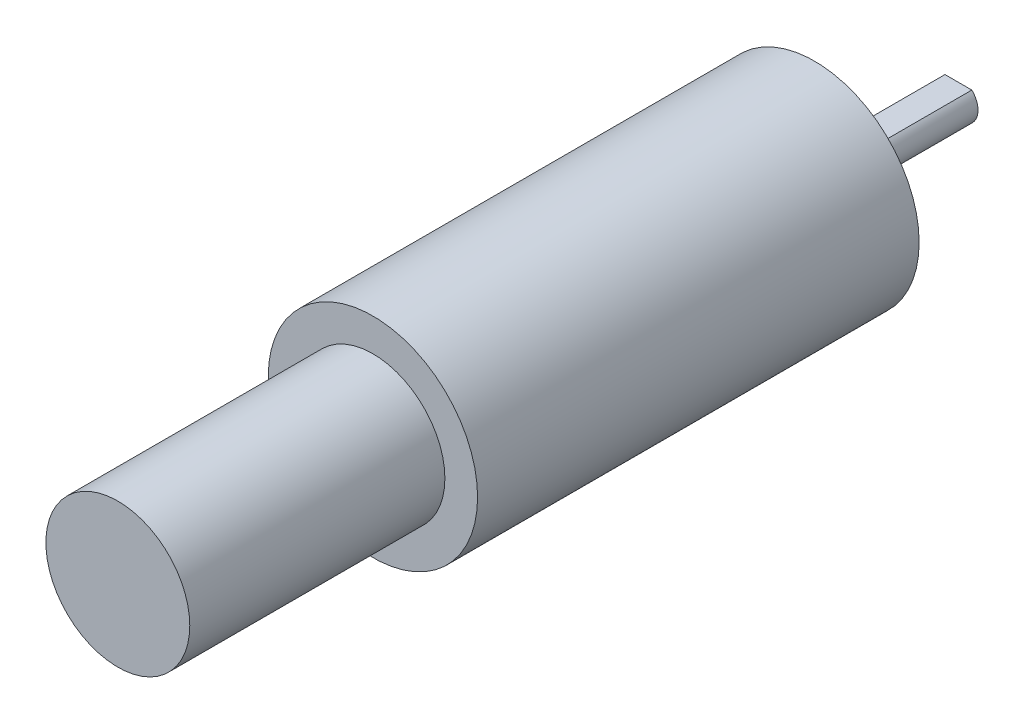
ISO-10303-21;
HEADER;
FILE_DESCRIPTION(('STEP AP214'),'2;1');
FILE_NAME('part.step','',(''),(''),'','','');
FILE_SCHEMA(('AUTOMOTIVE_DESIGN { 1 0 10303 214 1 1 1 1 }'));
ENDSEC;
DATA;
#1=APPLICATION_CONTEXT('core data for automotive mechanical design processes');
#2=APPLICATION_PROTOCOL_DEFINITION('international standard','automotive_design',2000,#1);
#3=PRODUCT_CONTEXT('',#1,'mechanical');
#4=PRODUCT('Part','Part','',(#3));
#5=PRODUCT_RELATED_PRODUCT_CATEGORY('part','',(#4));
#6=PRODUCT_DEFINITION_FORMATION('','',#4);
#7=PRODUCT_DEFINITION_CONTEXT('part definition',#1,'design');
#8=PRODUCT_DEFINITION('design','',#6,#7);
#9=PRODUCT_DEFINITION_SHAPE('','',#8);
#10=(LENGTH_UNIT() NAMED_UNIT(*) SI_UNIT(.MILLI.,.METRE.));
#11=(NAMED_UNIT(*) PLANE_ANGLE_UNIT() SI_UNIT($,.RADIAN.));
#12=(NAMED_UNIT(*) SI_UNIT($,.STERADIAN.) SOLID_ANGLE_UNIT());
#13=UNCERTAINTY_MEASURE_WITH_UNIT(LENGTH_MEASURE(1.E-05),#10,'distance_accuracy_value','');
#14=(GEOMETRIC_REPRESENTATION_CONTEXT(3) GLOBAL_UNCERTAINTY_ASSIGNED_CONTEXT((#13)) GLOBAL_UNIT_ASSIGNED_CONTEXT((#10,
#11,#12)) REPRESENTATION_CONTEXT('',''));
#15=CARTESIAN_POINT('',(0.,0.,0.));
#16=DIRECTION('',(0.,0.,1.));
#17=DIRECTION('',(1.,0.,0.));
#18=AXIS2_PLACEMENT_3D('',#15,#16,#17);
#19=CARTESIAN_POINT('',(0.,0.,67.5));
#20=DIRECTION('',(0.,0.,1.));
#21=DIRECTION('',(1.,0.,0.));
#22=AXIS2_PLACEMENT_3D('',#19,#20,#21);
#23=PLANE('',#22);
#24=CARTESIAN_POINT('',(0.,0.,67.5));
#25=DIRECTION('',(0.,0.,1.));
#26=DIRECTION('',(1.,0.,0.));
#27=AXIS2_PLACEMENT_3D('',#24,#25,#26);
#28=CIRCLE('',#27,16.);
#29=CARTESIAN_POINT('',(16.,0.,67.5));
#30=VERTEX_POINT('',#29);
#31=EDGE_CURVE('E128',#30,#30,#28,.T.);
#32=ORIENTED_EDGE('',*,*,#31,.T.);
#33=EDGE_LOOP('',(#32));
#34=FACE_BOUND('',#33,.T.);
#35=CARTESIAN_POINT('',(0.,0.,67.5));
#36=DIRECTION('',(0.,0.,1.));
#37=DIRECTION('',(1.,0.,0.));
#38=AXIS2_PLACEMENT_3D('',#35,#36,#37);
#39=CIRCLE('',#38,11.);
#40=CARTESIAN_POINT('',(11.,0.,67.5));
#41=VERTEX_POINT('',#40);
#42=EDGE_CURVE('E108',#41,#41,#39,.T.);
#43=ORIENTED_EDGE('',*,*,#42,.F.);
#44=EDGE_LOOP('',(#43));
#45=FACE_BOUND('',#44,.T.);
#46=ADVANCED_FACE('F36',(#34,#45),#23,.T.);
#47=CARTESIAN_POINT('',(0.,0.,-1.));
#48=DIRECTION('',(0.,0.,-1.));
#49=DIRECTION('',(-1.,0.,0.));
#50=AXIS2_PLACEMENT_3D('',#47,#48,#49);
#51=PLANE('',#50);
#52=CARTESIAN_POINT('',(0.,0.,-1.));
#53=DIRECTION('',(0.,0.,-1.));
#54=DIRECTION('',(-1.,0.,0.));
#55=AXIS2_PLACEMENT_3D('',#52,#53,#54);
#56=CIRCLE('',#55,9.);
#57=CARTESIAN_POINT('',(-9.,0.,-1.));
#58=VERTEX_POINT('',#57);
#59=EDGE_CURVE('E122',#58,#58,#56,.T.);
#60=ORIENTED_EDGE('',*,*,#59,.T.);
#61=EDGE_LOOP('',(#60));
#62=FACE_BOUND('',#61,.T.);
#63=CARTESIAN_POINT('',(0.,0.,-1.));
#64=DIRECTION('',(0.,0.,-1.));
#65=DIRECTION('',(-1.,0.,0.));
#66=AXIS2_PLACEMENT_3D('',#63,#64,#65);
#67=CIRCLE('',#66,3.);
#68=CARTESIAN_POINT('',(-3.,0.,-1.));
#69=VERTEX_POINT('',#68);
#70=EDGE_CURVE('E118',#69,#69,#67,.T.);
#71=ORIENTED_EDGE('',*,*,#70,.F.);
#72=EDGE_LOOP('',(#71));
#73=FACE_BOUND('',#72,.T.);
#74=ADVANCED_FACE('F155',(#62,#73),#51,.T.);
#75=CARTESIAN_POINT('',(0.,0.,0.));
#76=DIRECTION('',(0.,0.,1.));
#77=DIRECTION('',(1.,0.,0.));
#78=AXIS2_PLACEMENT_3D('',#75,#76,#77);
#79=PLANE('',#78);
#80=CARTESIAN_POINT('',(-13.,1.36167851083266E-13,0.));
#81=DIRECTION('',(0.,0.,-1.));
#82=DIRECTION('',(-1.,0.,0.));
#83=AXIS2_PLACEMENT_3D('',#80,#81,#82);
#84=CIRCLE('',#83,1.25);
#85=CARTESIAN_POINT('',(-14.25,1.36167851083266E-13,0.));
#86=VERTEX_POINT('',#85);
#87=EDGE_CURVE('E86',#86,#86,#84,.T.);
#88=ORIENTED_EDGE('',*,*,#87,.F.);
#89=EDGE_LOOP('',(#88));
#90=FACE_BOUND('',#89,.T.);
#91=CARTESIAN_POINT('',(0.,-13.,0.));
#92=DIRECTION('',(0.,0.,-1.));
#93=DIRECTION('',(-1.,0.,0.));
#94=AXIS2_PLACEMENT_3D('',#91,#92,#93);
#95=CIRCLE('',#94,1.25);
#96=CARTESIAN_POINT('',(-1.25,-13.,0.));
#97=VERTEX_POINT('',#96);
#98=EDGE_CURVE('E85',#97,#97,#95,.T.);
#99=ORIENTED_EDGE('',*,*,#98,.F.);
#100=EDGE_LOOP('',(#99));
#101=FACE_BOUND('',#100,.T.);
#102=CARTESIAN_POINT('',(13.,0.,0.));
#103=DIRECTION('',(0.,0.,-1.));
#104=DIRECTION('',(-1.,0.,0.));
#105=AXIS2_PLACEMENT_3D('',#102,#103,#104);
#106=CIRCLE('',#105,1.25);
#107=CARTESIAN_POINT('',(11.75,0.,0.));
#108=VERTEX_POINT('',#107);
#109=EDGE_CURVE('E96',#108,#108,#106,.T.);
#110=ORIENTED_EDGE('',*,*,#109,.F.);
#111=EDGE_LOOP('',(#110));
#112=FACE_BOUND('',#111,.T.);
#113=CARTESIAN_POINT('',(0.,13.,0.));
#114=DIRECTION('',(0.,0.,-1.));
#115=DIRECTION('',(-1.,0.,0.));
#116=AXIS2_PLACEMENT_3D('',#113,#114,#115);
#117=CIRCLE('',#116,1.25);
#118=CARTESIAN_POINT('',(-1.25,13.,0.));
#119=VERTEX_POINT('',#118);
#120=EDGE_CURVE('E102',#119,#119,#117,.T.);
#121=ORIENTED_EDGE('',*,*,#120,.F.);
#122=EDGE_LOOP('',(#121));
#123=FACE_BOUND('',#122,.T.);
#124=CARTESIAN_POINT('',(0.,0.,0.));
#125=DIRECTION('',(0.,0.,1.));
#126=DIRECTION('',(1.,0.,0.));
#127=AXIS2_PLACEMENT_3D('',#124,#125,#126);
#128=CIRCLE('',#127,16.);
#129=CARTESIAN_POINT('',(16.,0.,0.));
#130=VERTEX_POINT('',#129);
#131=EDGE_CURVE('E127',#130,#130,#128,.T.);
#132=ORIENTED_EDGE('',*,*,#131,.F.);
#133=EDGE_LOOP('',(#132));
#134=FACE_BOUND('',#133,.T.);
#135=CARTESIAN_POINT('',(0.,0.,0.));
#136=DIRECTION('',(0.,0.,1.));
#137=DIRECTION('',(1.,0.,0.));
#138=AXIS2_PLACEMENT_3D('',#135,#136,#137);
#139=CIRCLE('',#138,9.);
#140=CARTESIAN_POINT('',(9.,0.,0.));
#141=VERTEX_POINT('',#140);
#142=EDGE_CURVE('E131',#141,#141,#139,.F.);
#143=ORIENTED_EDGE('',*,*,#142,.F.);
#144=EDGE_LOOP('',(#143));
#145=FACE_BOUND('',#144,.T.);
#146=ADVANCED_FACE('F161',(#90,#101,#112,#123,#134,#145),#79,.F.);
#147=CARTESIAN_POINT('',(0.,0.,67.5));
#148=DIRECTION('',(0.,0.,-1.));
#149=DIRECTION('',(-1.,0.,0.));
#150=AXIS2_PLACEMENT_3D('',#147,#148,#149);
#151=CYLINDRICAL_SURFACE('',#150,16.);
#152=ORIENTED_EDGE('',*,*,#31,.F.);
#153=EDGE_LOOP('',(#152));
#154=FACE_BOUND('',#153,.T.);
#155=ORIENTED_EDGE('',*,*,#131,.T.);
#156=EDGE_LOOP('',(#155));
#157=FACE_BOUND('',#156,.T.);
#158=ADVANCED_FACE('F38',(#154,#157),#151,.T.);
#159=CARTESIAN_POINT('',(0.,0.,-1.));
#160=DIRECTION('',(0.,0.,1.));
#161=DIRECTION('',(1.,0.,0.));
#162=AXIS2_PLACEMENT_3D('',#159,#160,#161);
#163=CYLINDRICAL_SURFACE('',#162,9.);
#164=ORIENTED_EDGE('',*,*,#59,.F.);
#165=EDGE_LOOP('',(#164));
#166=FACE_BOUND('',#165,.T.);
#167=ORIENTED_EDGE('',*,*,#142,.T.);
#168=EDGE_LOOP('',(#167));
#169=FACE_BOUND('',#168,.T.);
#170=ADVANCED_FACE('F151',(#166,#169),#163,.T.);
#171=CARTESIAN_POINT('',(0.,0.,-22.));
#172=DIRECTION('',(0.,0.,1.));
#173=DIRECTION('',(1.,0.,0.));
#174=AXIS2_PLACEMENT_3D('',#171,#172,#173);
#175=CYLINDRICAL_SURFACE('',#174,3.);
#176=CARTESIAN_POINT('',(0.,0.,-22.));
#177=DIRECTION('',(0.,0.,-1.));
#178=DIRECTION('',(-1.,0.,0.));
#179=AXIS2_PLACEMENT_3D('',#176,#177,#178);
#180=CIRCLE('',#179,3.);
#181=CARTESIAN_POINT('',(2.05320505878319,2.18731547486574,-22.));
#182=VERTEX_POINT('',#181);
#183=CARTESIAN_POINT('',(-2.05320505878318,2.18731547486574,-22.));
#184=VERTEX_POINT('',#183);
#185=EDGE_CURVE('E119',#182,#184,#180,.T.);
#186=ORIENTED_EDGE('',*,*,#185,.F.);
#187=DIRECTION('',(0.,0.,1.));
#188=VECTOR('',#187,1.);
#189=CARTESIAN_POINT('',(2.05320505878319,2.18731547486574,-22.));
#190=LINE('',#189,#188);
#191=CARTESIAN_POINT('',(2.05320505878319,2.18731547486574,-4.30200000000001));
#192=VERTEX_POINT('',#191);
#193=EDGE_CURVE('E51',#182,#192,#190,.T.);
#194=ORIENTED_EDGE('',*,*,#193,.T.);
#195=CARTESIAN_POINT('',(0.,0.,-4.30200000000001));
#196=DIRECTION('',(0.,0.,1.));
#197=DIRECTION('',(1.,0.,0.));
#198=AXIS2_PLACEMENT_3D('',#195,#196,#197);
#199=CIRCLE('',#198,3.);
#200=CARTESIAN_POINT('',(-2.05320505878319,2.18731547486574,-4.30200000000001));
#201=VERTEX_POINT('',#200);
#202=EDGE_CURVE('E11',#192,#201,#199,.T.);
#203=ORIENTED_EDGE('',*,*,#202,.T.);
#204=DIRECTION('',(0.,0.,1.));
#205=VECTOR('',#204,1.);
#206=CARTESIAN_POINT('',(-2.05320505878319,2.18731547486574,-22.));
#207=LINE('',#206,#205);
#208=EDGE_CURVE('E56',#201,#184,#207,.F.);
#209=ORIENTED_EDGE('',*,*,#208,.T.);
#210=EDGE_LOOP('',(#186,#194,#203,#209));
#211=FACE_BOUND('',#210,.T.);
#212=ORIENTED_EDGE('',*,*,#70,.T.);
#213=EDGE_LOOP('',(#212));
#214=FACE_BOUND('',#213,.T.);
#215=ADVANCED_FACE('F139',(#211,#214),#175,.T.);
#216=CARTESIAN_POINT('',(0.,0.,-22.));
#217=DIRECTION('',(0.,0.,-1.));
#218=DIRECTION('',(-1.,0.,0.));
#219=AXIS2_PLACEMENT_3D('',#216,#217,#218);
#220=PLANE('',#219);
#221=DIRECTION('',(-1.,0.,0.));
#222=VECTOR('',#221,1.);
#223=CARTESIAN_POINT('',(0.,2.18731547486574,-22.));
#224=LINE('',#223,#222);
#225=EDGE_CURVE('E44',#182,#184,#224,.T.);
#226=ORIENTED_EDGE('',*,*,#225,.F.);
#227=ORIENTED_EDGE('',*,*,#185,.T.);
#228=EDGE_LOOP('',(#226,#227));
#229=FACE_BOUND('',#228,.T.);
#230=ADVANCED_FACE('F141',(#229),#220,.T.);
#231=CARTESIAN_POINT('',(-3.4650542176086,5.60905651475423,-4.30200000000001));
#232=DIRECTION('',(0.,0.,1.));
#233=DIRECTION('',(1.,0.,0.));
#234=AXIS2_PLACEMENT_3D('',#231,#232,#233);
#235=PLANE('',#234);
#236=DIRECTION('',(-1.,0.,0.));
#237=VECTOR('',#236,1.);
#238=CARTESIAN_POINT('',(3.16186197356785,2.18731547486574,-4.30200000000001));
#239=LINE('',#238,#237);
#240=EDGE_CURVE('E112',#192,#201,#239,.T.);
#241=ORIENTED_EDGE('',*,*,#240,.T.);
#242=ORIENTED_EDGE('',*,*,#202,.F.);
#243=EDGE_LOOP('',(#241,#242));
#244=FACE_BOUND('',#243,.T.);
#245=ADVANCED_FACE('F143',(#244),#235,.F.);
#246=CARTESIAN_POINT('',(3.16186197356785,2.18731547486574,-4.30200000000001));
#247=DIRECTION('',(0.,-1.,0.));
#248=DIRECTION('',(0.,0.,-1.));
#249=AXIS2_PLACEMENT_3D('',#246,#247,#248);
#250=PLANE('',#249);
#251=ORIENTED_EDGE('',*,*,#225,.T.);
#252=ORIENTED_EDGE('',*,*,#208,.F.);
#253=ORIENTED_EDGE('',*,*,#240,.F.);
#254=ORIENTED_EDGE('',*,*,#193,.F.);
#255=EDGE_LOOP('',(#251,#252,#253,#254));
#256=FACE_BOUND('',#255,.T.);
#257=ADVANCED_FACE('F135',(#256),#250,.F.);
#258=CARTESIAN_POINT('',(0.,0.,106.5));
#259=DIRECTION('',(0.,0.,-1.));
#260=DIRECTION('',(-1.,0.,0.));
#261=AXIS2_PLACEMENT_3D('',#258,#259,#260);
#262=CYLINDRICAL_SURFACE('',#261,11.);
#263=CARTESIAN_POINT('',(0.,0.,106.5));
#264=DIRECTION('',(0.,0.,1.));
#265=DIRECTION('',(1.,0.,0.));
#266=AXIS2_PLACEMENT_3D('',#263,#264,#265);
#267=CIRCLE('',#266,11.);
#268=CARTESIAN_POINT('',(11.,0.,106.5));
#269=VERTEX_POINT('',#268);
#270=EDGE_CURVE('E109',#269,#269,#267,.T.);
#271=ORIENTED_EDGE('',*,*,#270,.F.);
#272=EDGE_LOOP('',(#271));
#273=FACE_BOUND('',#272,.T.);
#274=ORIENTED_EDGE('',*,*,#42,.T.);
#275=EDGE_LOOP('',(#274));
#276=FACE_BOUND('',#275,.T.);
#277=ADVANCED_FACE('F218',(#273,#276),#262,.T.);
#278=CARTESIAN_POINT('',(0.,0.,106.5));
#279=DIRECTION('',(0.,0.,1.));
#280=DIRECTION('',(1.,0.,0.));
#281=AXIS2_PLACEMENT_3D('',#278,#279,#280);
#282=PLANE('',#281);
#283=ORIENTED_EDGE('',*,*,#270,.T.);
#284=EDGE_LOOP('',(#283));
#285=FACE_BOUND('',#284,.T.);
#286=ADVANCED_FACE('F231',(#285),#282,.T.);
#287=CARTESIAN_POINT('',(0.,13.,7.62));
#288=DIRECTION('',(0.,0.,-1.));
#289=DIRECTION('',(-1.,0.,0.));
#290=AXIS2_PLACEMENT_3D('',#287,#288,#289);
#291=CONICAL_SURFACE('',#290,1.25,1.02974425867665);
#292=CARTESIAN_POINT('',(0.,13.,8.37107577378445));
#293=VERTEX_POINT('',#292);
#294=VERTEX_LOOP('',#293);
#295=FACE_BOUND('',#294,.T.);
#296=CARTESIAN_POINT('',(0.,13.,7.62));
#297=DIRECTION('',(0.,0.,-1.));
#298=DIRECTION('',(-1.,0.,0.));
#299=AXIS2_PLACEMENT_3D('',#296,#297,#298);
#300=CIRCLE('',#299,1.25);
#301=CARTESIAN_POINT('',(-1.25,13.,7.62));
#302=VERTEX_POINT('',#301);
#303=EDGE_CURVE('E105',#302,#302,#300,.T.);
#304=ORIENTED_EDGE('',*,*,#303,.T.);
#305=EDGE_LOOP('',(#304));
#306=FACE_BOUND('',#305,.T.);
#307=ADVANCED_FACE('F241',(#295,#306),#291,.F.);
#308=CARTESIAN_POINT('',(0.,13.,0.));
#309=DIRECTION('',(0.,0.,-1.));
#310=DIRECTION('',(-1.,0.,0.));
#311=AXIS2_PLACEMENT_3D('',#308,#309,#310);
#312=CYLINDRICAL_SURFACE('',#311,1.25);
#313=ORIENTED_EDGE('',*,*,#303,.F.);
#314=EDGE_LOOP('',(#313));
#315=FACE_BOUND('',#314,.T.);
#316=ORIENTED_EDGE('',*,*,#120,.T.);
#317=EDGE_LOOP('',(#316));
#318=FACE_BOUND('',#317,.T.);
#319=ADVANCED_FACE('F251',(#315,#318),#312,.F.);
#320=CARTESIAN_POINT('',(13.,0.,7.62));
#321=DIRECTION('',(0.,0.,-1.));
#322=DIRECTION('',(-1.,0.,0.));
#323=AXIS2_PLACEMENT_3D('',#320,#321,#322);
#324=CONICAL_SURFACE('',#323,1.25,1.02974425867665);
#325=CARTESIAN_POINT('',(13.,0.,8.37107577378445));
#326=VERTEX_POINT('',#325);
#327=VERTEX_LOOP('',#326);
#328=FACE_BOUND('',#327,.T.);
#329=CARTESIAN_POINT('',(13.,0.,7.62));
#330=DIRECTION('',(0.,0.,-1.));
#331=DIRECTION('',(-1.,0.,0.));
#332=AXIS2_PLACEMENT_3D('',#329,#330,#331);
#333=CIRCLE('',#332,1.25);
#334=CARTESIAN_POINT('',(11.75,0.,7.62));
#335=VERTEX_POINT('',#334);
#336=EDGE_CURVE('E99',#335,#335,#333,.T.);
#337=ORIENTED_EDGE('',*,*,#336,.T.);
#338=EDGE_LOOP('',(#337));
#339=FACE_BOUND('',#338,.T.);
#340=ADVANCED_FACE('F260',(#328,#339),#324,.F.);
#341=CARTESIAN_POINT('',(13.,0.,0.));
#342=DIRECTION('',(0.,0.,-1.));
#343=DIRECTION('',(-1.,0.,0.));
#344=AXIS2_PLACEMENT_3D('',#341,#342,#343);
#345=CYLINDRICAL_SURFACE('',#344,1.25);
#346=ORIENTED_EDGE('',*,*,#336,.F.);
#347=EDGE_LOOP('',(#346));
#348=FACE_BOUND('',#347,.T.);
#349=ORIENTED_EDGE('',*,*,#109,.T.);
#350=EDGE_LOOP('',(#349));
#351=FACE_BOUND('',#350,.T.);
#352=ADVANCED_FACE('F276',(#348,#351),#345,.F.);
#353=CARTESIAN_POINT('',(0.,-13.,7.62));
#354=DIRECTION('',(0.,0.,-1.));
#355=DIRECTION('',(-1.,0.,0.));
#356=AXIS2_PLACEMENT_3D('',#353,#354,#355);
#357=CONICAL_SURFACE('',#356,1.25,1.02974425867665);
#358=CARTESIAN_POINT('',(0.,-13.,8.37107577378445));
#359=VERTEX_POINT('',#358);
#360=VERTEX_LOOP('',#359);
#361=FACE_BOUND('',#360,.T.);
#362=CARTESIAN_POINT('',(0.,-13.,7.62));
#363=DIRECTION('',(0.,0.,-1.));
#364=DIRECTION('',(-1.,0.,0.));
#365=AXIS2_PLACEMENT_3D('',#362,#363,#364);
#366=CIRCLE('',#365,1.25);
#367=CARTESIAN_POINT('',(-1.25,-13.,7.62));
#368=VERTEX_POINT('',#367);
#369=EDGE_CURVE('E89',#368,#368,#366,.T.);
#370=ORIENTED_EDGE('',*,*,#369,.T.);
#371=EDGE_LOOP('',(#370));
#372=FACE_BOUND('',#371,.T.);
#373=ADVANCED_FACE('F286',(#361,#372),#357,.F.);
#374=CARTESIAN_POINT('',(0.,-13.,0.));
#375=DIRECTION('',(0.,0.,-1.));
#376=DIRECTION('',(-1.,0.,0.));
#377=AXIS2_PLACEMENT_3D('',#374,#375,#376);
#378=CYLINDRICAL_SURFACE('',#377,1.25);
#379=ORIENTED_EDGE('',*,*,#369,.F.);
#380=EDGE_LOOP('',(#379));
#381=FACE_BOUND('',#380,.T.);
#382=ORIENTED_EDGE('',*,*,#98,.T.);
#383=EDGE_LOOP('',(#382));
#384=FACE_BOUND('',#383,.T.);
#385=ADVANCED_FACE('F79',(#381,#384),#378,.F.);
#386=CARTESIAN_POINT('',(-13.,1.36167851083266E-13,7.62));
#387=DIRECTION('',(0.,0.,-1.));
#388=DIRECTION('',(-1.,0.,0.));
#389=AXIS2_PLACEMENT_3D('',#386,#387,#388);
#390=CONICAL_SURFACE('',#389,1.25,1.02974425867665);
#391=CARTESIAN_POINT('',(-13.,1.36167851083266E-13,8.37107577378445));
#392=VERTEX_POINT('',#391);
#393=VERTEX_LOOP('',#392);
#394=FACE_BOUND('',#393,.T.);
#395=CARTESIAN_POINT('',(-13.,1.36167851083266E-13,7.62));
#396=DIRECTION('',(0.,0.,-1.));
#397=DIRECTION('',(-1.,0.,0.));
#398=AXIS2_PLACEMENT_3D('',#395,#396,#397);
#399=CIRCLE('',#398,1.25);
#400=CARTESIAN_POINT('',(-14.25,1.36167851083266E-13,7.62));
#401=VERTEX_POINT('',#400);
#402=EDGE_CURVE('E83',#401,#401,#399,.T.);
#403=ORIENTED_EDGE('',*,*,#402,.T.);
#404=EDGE_LOOP('',(#403));
#405=FACE_BOUND('',#404,.T.);
#406=ADVANCED_FACE('F75',(#394,#405),#390,.F.);
#407=CARTESIAN_POINT('',(-13.,1.36167851083266E-13,0.));
#408=DIRECTION('',(0.,0.,-1.));
#409=DIRECTION('',(-1.,0.,0.));
#410=AXIS2_PLACEMENT_3D('',#407,#408,#409);
#411=CYLINDRICAL_SURFACE('',#410,1.25);
#412=ORIENTED_EDGE('',*,*,#402,.F.);
#413=EDGE_LOOP('',(#412));
#414=FACE_BOUND('',#413,.T.);
#415=ORIENTED_EDGE('',*,*,#87,.T.);
#416=EDGE_LOOP('',(#415));
#417=FACE_BOUND('',#416,.T.);
#418=ADVANCED_FACE('F78',(#414,#417),#411,.F.);
#419=CLOSED_SHELL('',(#46,#74,#146,#158,#170,#215,#230,#245,#257,#277,#286,#307,#319,#340,#352,
#373,#385,#406,#418));
#420=MANIFOLD_SOLID_BREP('B2',#419);
#421=ADVANCED_BREP_SHAPE_REPRESENTATION('',(#18,#420),#14);
#422=SHAPE_DEFINITION_REPRESENTATION(#9,#421);
ENDSEC;
END-ISO-10303-21;
